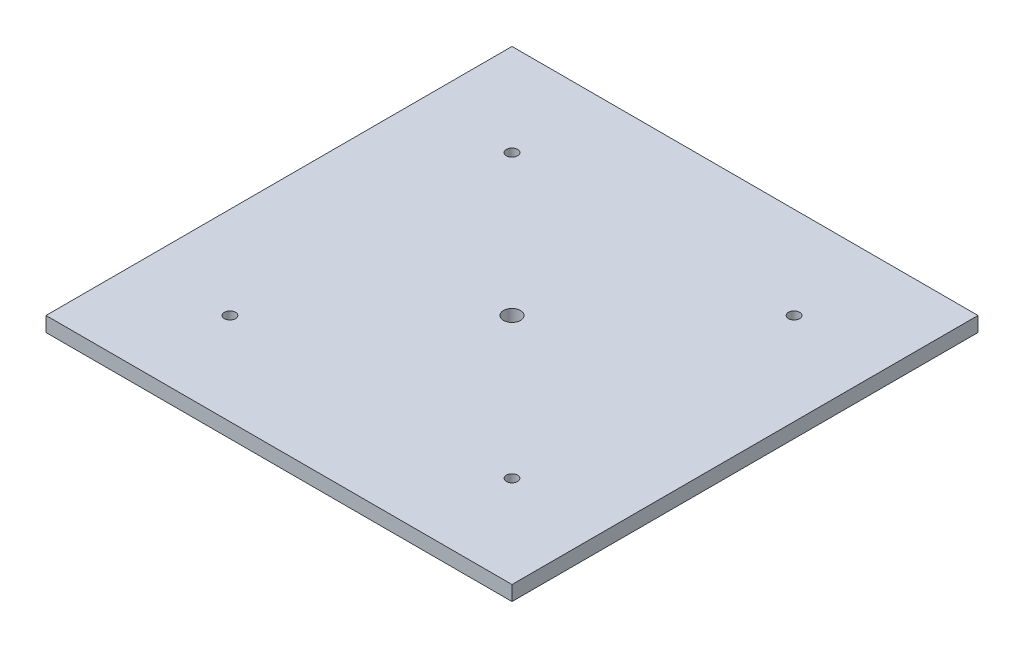
ISO-10303-21;
HEADER;
FILE_DESCRIPTION(('STEP AP214'),'2;1');
FILE_NAME('part.step','',(''),(''),'','','');
FILE_SCHEMA(('AUTOMOTIVE_DESIGN { 1 0 10303 214 1 1 1 1 }'));
ENDSEC;
DATA;
#1=APPLICATION_CONTEXT('core data for automotive mechanical design processes');
#2=APPLICATION_PROTOCOL_DEFINITION('international standard','automotive_design',2000,#1);
#3=PRODUCT_CONTEXT('',#1,'mechanical');
#4=PRODUCT('Part','Part','',(#3));
#5=PRODUCT_RELATED_PRODUCT_CATEGORY('part','',(#4));
#6=PRODUCT_DEFINITION_FORMATION('','',#4);
#7=PRODUCT_DEFINITION_CONTEXT('part definition',#1,'design');
#8=PRODUCT_DEFINITION('design','',#6,#7);
#9=PRODUCT_DEFINITION_SHAPE('','',#8);
#10=(LENGTH_UNIT() NAMED_UNIT(*) SI_UNIT(.MILLI.,.METRE.));
#11=(NAMED_UNIT(*) PLANE_ANGLE_UNIT() SI_UNIT($,.RADIAN.));
#12=(NAMED_UNIT(*) SI_UNIT($,.STERADIAN.) SOLID_ANGLE_UNIT());
#13=UNCERTAINTY_MEASURE_WITH_UNIT(LENGTH_MEASURE(1.E-05),#10,'distance_accuracy_value','');
#14=(GEOMETRIC_REPRESENTATION_CONTEXT(3) GLOBAL_UNCERTAINTY_ASSIGNED_CONTEXT((#13)) GLOBAL_UNIT_ASSIGNED_CONTEXT((#10,
#11,#12)) REPRESENTATION_CONTEXT('',''));
#15=CARTESIAN_POINT('',(0.,0.,0.));
#16=DIRECTION('',(0.,0.,1.));
#17=DIRECTION('',(1.,0.,0.));
#18=AXIS2_PLACEMENT_3D('',#15,#16,#17);
#19=CARTESIAN_POINT('',(0.,0.,0.));
#20=DIRECTION('',(0.,1.,0.));
#21=DIRECTION('',(0.,0.,1.));
#22=AXIS2_PLACEMENT_3D('',#19,#20,#21);
#23=PLANE('',#22);
#24=CARTESIAN_POINT('',(-60.53,0.,60.53));
#25=DIRECTION('',(0.,1.,0.));
#26=DIRECTION('',(0.,0.,1.));
#27=AXIS2_PLACEMENT_3D('',#24,#25,#26);
#28=CIRCLE('',#27,2.4);
#29=CARTESIAN_POINT('',(-60.53,0.,62.93));
#30=VERTEX_POINT('',#29);
#31=EDGE_CURVE('E132',#30,#30,#28,.F.);
#32=ORIENTED_EDGE('',*,*,#31,.F.);
#33=EDGE_LOOP('',(#32));
#34=FACE_BOUND('',#33,.T.);
#35=CARTESIAN_POINT('',(0.,0.,0.));
#36=DIRECTION('',(0.,1.,0.));
#37=DIRECTION('',(0.,0.,1.));
#38=AXIS2_PLACEMENT_3D('',#35,#36,#37);
#39=CIRCLE('',#38,3.675);
#40=CARTESIAN_POINT('',(0.,0.,3.675));
#41=VERTEX_POINT('',#40);
#42=EDGE_CURVE('E111',#41,#41,#39,.T.);
#43=ORIENTED_EDGE('',*,*,#42,.T.);
#44=EDGE_LOOP('',(#43));
#45=FACE_BOUND('',#44,.T.);
#46=DIRECTION('',(0.,0.,1.));
#47=VECTOR('',#46,1.);
#48=CARTESIAN_POINT('',(-100.,0.,-100.));
#49=LINE('',#48,#47);
#50=CARTESIAN_POINT('',(-100.,0.,-100.));
#51=VERTEX_POINT('',#50);
#52=CARTESIAN_POINT('',(-100.,0.,100.));
#53=VERTEX_POINT('',#52);
#54=EDGE_CURVE('E107',#51,#53,#49,.T.);
#55=ORIENTED_EDGE('',*,*,#54,.F.);
#56=DIRECTION('',(-1.,0.,0.));
#57=VECTOR('',#56,1.);
#58=CARTESIAN_POINT('',(-100.,0.,-100.));
#59=LINE('',#58,#57);
#60=CARTESIAN_POINT('',(100.,0.,-100.));
#61=VERTEX_POINT('',#60);
#62=EDGE_CURVE('E79',#61,#51,#59,.T.);
#63=ORIENTED_EDGE('',*,*,#62,.F.);
#64=DIRECTION('',(0.,0.,-1.));
#65=VECTOR('',#64,1.);
#66=CARTESIAN_POINT('',(100.,0.,-100.));
#67=LINE('',#66,#65);
#68=CARTESIAN_POINT('',(100.,0.,100.));
#69=VERTEX_POINT('',#68);
#70=EDGE_CURVE('E73',#69,#61,#67,.T.);
#71=ORIENTED_EDGE('',*,*,#70,.F.);
#72=DIRECTION('',(1.,0.,0.));
#73=VECTOR('',#72,1.);
#74=CARTESIAN_POINT('',(-100.,0.,100.));
#75=LINE('',#74,#73);
#76=EDGE_CURVE('E96',#53,#69,#75,.T.);
#77=ORIENTED_EDGE('',*,*,#76,.F.);
#78=EDGE_LOOP('',(#55,#63,#71,#77));
#79=FACE_BOUND('',#78,.T.);
#80=CARTESIAN_POINT('',(60.53,0.,60.53));
#81=DIRECTION('',(0.,1.,0.));
#82=DIRECTION('',(0.,0.,1.));
#83=AXIS2_PLACEMENT_3D('',#80,#81,#82);
#84=CIRCLE('',#83,2.39999999999999);
#85=CARTESIAN_POINT('',(60.53,0.,62.93));
#86=VERTEX_POINT('',#85);
#87=EDGE_CURVE('E140',#86,#86,#84,.F.);
#88=ORIENTED_EDGE('',*,*,#87,.F.);
#89=EDGE_LOOP('',(#88));
#90=FACE_BOUND('',#89,.T.);
#91=CARTESIAN_POINT('',(60.53,0.,-60.53));
#92=DIRECTION('',(0.,1.,0.));
#93=DIRECTION('',(0.,0.,1.));
#94=AXIS2_PLACEMENT_3D('',#91,#92,#93);
#95=CIRCLE('',#94,2.4);
#96=CARTESIAN_POINT('',(60.53,0.,-58.13));
#97=VERTEX_POINT('',#96);
#98=EDGE_CURVE('E148',#97,#97,#95,.F.);
#99=ORIENTED_EDGE('',*,*,#98,.F.);
#100=EDGE_LOOP('',(#99));
#101=FACE_BOUND('',#100,.T.);
#102=CARTESIAN_POINT('',(-60.53,0.,-60.53));
#103=DIRECTION('',(0.,1.,0.));
#104=DIRECTION('',(0.,0.,1.));
#105=AXIS2_PLACEMENT_3D('',#102,#103,#104);
#106=CIRCLE('',#105,2.4);
#107=CARTESIAN_POINT('',(-60.53,0.,-58.13));
#108=VERTEX_POINT('',#107);
#109=EDGE_CURVE('E156',#108,#108,#106,.F.);
#110=ORIENTED_EDGE('',*,*,#109,.F.);
#111=EDGE_LOOP('',(#110));
#112=FACE_BOUND('',#111,.T.);
#113=ADVANCED_FACE('F38',(#34,#45,#79,#90,#101,#112),#23,.F.);
#114=CARTESIAN_POINT('',(-100.,6.35,-100.));
#115=DIRECTION('',(1.,0.,0.));
#116=DIRECTION('',(0.,0.,-1.));
#117=AXIS2_PLACEMENT_3D('',#114,#115,#116);
#118=PLANE('',#117);
#119=ORIENTED_EDGE('',*,*,#54,.T.);
#120=DIRECTION('',(0.,-1.,0.));
#121=VECTOR('',#120,1.);
#122=CARTESIAN_POINT('',(-100.,6.35,100.));
#123=LINE('',#122,#121);
#124=CARTESIAN_POINT('',(-100.,6.35,100.));
#125=VERTEX_POINT('',#124);
#126=EDGE_CURVE('E11',#125,#53,#123,.T.);
#127=ORIENTED_EDGE('',*,*,#126,.F.);
#128=DIRECTION('',(0.,0.,1.));
#129=VECTOR('',#128,1.);
#130=CARTESIAN_POINT('',(-100.,6.35,-100.));
#131=LINE('',#130,#129);
#132=CARTESIAN_POINT('',(-100.,6.35,-100.));
#133=VERTEX_POINT('',#132);
#134=EDGE_CURVE('E91',#133,#125,#131,.T.);
#135=ORIENTED_EDGE('',*,*,#134,.F.);
#136=DIRECTION('',(0.,-1.,0.));
#137=VECTOR('',#136,1.);
#138=CARTESIAN_POINT('',(-100.,6.35,-100.));
#139=LINE('',#138,#137);
#140=EDGE_CURVE('E103',#133,#51,#139,.T.);
#141=ORIENTED_EDGE('',*,*,#140,.T.);
#142=EDGE_LOOP('',(#119,#127,#135,#141));
#143=FACE_BOUND('',#142,.T.);
#144=ADVANCED_FACE('F40',(#143),#118,.F.);
#145=CARTESIAN_POINT('',(-100.,6.35,100.));
#146=DIRECTION('',(0.,0.,-1.));
#147=DIRECTION('',(-1.,0.,0.));
#148=AXIS2_PLACEMENT_3D('',#145,#146,#147);
#149=PLANE('',#148);
#150=ORIENTED_EDGE('',*,*,#76,.T.);
#151=DIRECTION('',(0.,-1.,0.));
#152=VECTOR('',#151,1.);
#153=CARTESIAN_POINT('',(100.,6.35,100.));
#154=LINE('',#153,#152);
#155=CARTESIAN_POINT('',(100.,6.35,100.));
#156=VERTEX_POINT('',#155);
#157=EDGE_CURVE('E48',#156,#69,#154,.T.);
#158=ORIENTED_EDGE('',*,*,#157,.F.);
#159=DIRECTION('',(1.,0.,0.));
#160=VECTOR('',#159,1.);
#161=CARTESIAN_POINT('',(-100.,6.35,100.));
#162=LINE('',#161,#160);
#163=EDGE_CURVE('E86',#125,#156,#162,.T.);
#164=ORIENTED_EDGE('',*,*,#163,.F.);
#165=ORIENTED_EDGE('',*,*,#126,.T.);
#166=EDGE_LOOP('',(#150,#158,#164,#165));
#167=FACE_BOUND('',#166,.T.);
#168=ADVANCED_FACE('F95',(#167),#149,.F.);
#169=CARTESIAN_POINT('',(100.,6.35,-100.));
#170=DIRECTION('',(-1.,0.,0.));
#171=DIRECTION('',(0.,0.,1.));
#172=AXIS2_PLACEMENT_3D('',#169,#170,#171);
#173=PLANE('',#172);
#174=ORIENTED_EDGE('',*,*,#70,.T.);
#175=DIRECTION('',(0.,-1.,0.));
#176=VECTOR('',#175,1.);
#177=CARTESIAN_POINT('',(100.,6.35,-100.));
#178=LINE('',#177,#176);
#179=CARTESIAN_POINT('',(100.,6.35,-100.));
#180=VERTEX_POINT('',#179);
#181=EDGE_CURVE('E98',#180,#61,#178,.T.);
#182=ORIENTED_EDGE('',*,*,#181,.F.);
#183=DIRECTION('',(0.,0.,-1.));
#184=VECTOR('',#183,1.);
#185=CARTESIAN_POINT('',(100.,6.35,-100.));
#186=LINE('',#185,#184);
#187=EDGE_CURVE('E89',#156,#180,#186,.T.);
#188=ORIENTED_EDGE('',*,*,#187,.F.);
#189=ORIENTED_EDGE('',*,*,#157,.T.);
#190=EDGE_LOOP('',(#174,#182,#188,#189));
#191=FACE_BOUND('',#190,.T.);
#192=ADVANCED_FACE('F99',(#191),#173,.F.);
#193=CARTESIAN_POINT('',(-100.,6.35,-100.));
#194=DIRECTION('',(0.,0.,1.));
#195=DIRECTION('',(1.,0.,0.));
#196=AXIS2_PLACEMENT_3D('',#193,#194,#195);
#197=PLANE('',#196);
#198=ORIENTED_EDGE('',*,*,#62,.T.);
#199=ORIENTED_EDGE('',*,*,#140,.F.);
#200=DIRECTION('',(-1.,0.,0.));
#201=VECTOR('',#200,1.);
#202=CARTESIAN_POINT('',(-100.,6.35,-100.));
#203=LINE('',#202,#201);
#204=EDGE_CURVE('E56',#180,#133,#203,.T.);
#205=ORIENTED_EDGE('',*,*,#204,.F.);
#206=ORIENTED_EDGE('',*,*,#181,.T.);
#207=EDGE_LOOP('',(#198,#199,#205,#206));
#208=FACE_BOUND('',#207,.T.);
#209=ADVANCED_FACE('F121',(#208),#197,.F.);
#210=CARTESIAN_POINT('',(0.,6.35,0.));
#211=DIRECTION('',(0.,1.,0.));
#212=DIRECTION('',(0.,0.,1.));
#213=AXIS2_PLACEMENT_3D('',#210,#211,#212);
#214=PLANE('',#213);
#215=CARTESIAN_POINT('',(-60.53,6.35,-60.53));
#216=DIRECTION('',(0.,1.,0.));
#217=DIRECTION('',(0.,0.,1.));
#218=AXIS2_PLACEMENT_3D('',#215,#216,#217);
#219=CIRCLE('',#218,2.4);
#220=CARTESIAN_POINT('',(-60.53,6.35,-58.13));
#221=VERTEX_POINT('',#220);
#222=EDGE_CURVE('E160',#221,#221,#219,.T.);
#223=ORIENTED_EDGE('',*,*,#222,.F.);
#224=EDGE_LOOP('',(#223));
#225=FACE_BOUND('',#224,.T.);
#226=CARTESIAN_POINT('',(60.53,6.35,-60.53));
#227=DIRECTION('',(0.,1.,0.));
#228=DIRECTION('',(0.,0.,1.));
#229=AXIS2_PLACEMENT_3D('',#226,#227,#228);
#230=CIRCLE('',#229,2.4);
#231=CARTESIAN_POINT('',(60.53,6.35,-58.13));
#232=VERTEX_POINT('',#231);
#233=EDGE_CURVE('E152',#232,#232,#230,.T.);
#234=ORIENTED_EDGE('',*,*,#233,.F.);
#235=EDGE_LOOP('',(#234));
#236=FACE_BOUND('',#235,.T.);
#237=CARTESIAN_POINT('',(60.53,6.35,60.53));
#238=DIRECTION('',(0.,1.,0.));
#239=DIRECTION('',(0.,0.,1.));
#240=AXIS2_PLACEMENT_3D('',#237,#238,#239);
#241=CIRCLE('',#240,2.39999999999999);
#242=CARTESIAN_POINT('',(60.53,6.35,62.93));
#243=VERTEX_POINT('',#242);
#244=EDGE_CURVE('E144',#243,#243,#241,.T.);
#245=ORIENTED_EDGE('',*,*,#244,.F.);
#246=EDGE_LOOP('',(#245));
#247=FACE_BOUND('',#246,.T.);
#248=CARTESIAN_POINT('',(-60.53,6.35,60.53));
#249=DIRECTION('',(0.,1.,0.));
#250=DIRECTION('',(0.,0.,1.));
#251=AXIS2_PLACEMENT_3D('',#248,#249,#250);
#252=CIRCLE('',#251,2.4);
#253=CARTESIAN_POINT('',(-60.53,6.35,62.93));
#254=VERTEX_POINT('',#253);
#255=EDGE_CURVE('E136',#254,#254,#252,.T.);
#256=ORIENTED_EDGE('',*,*,#255,.F.);
#257=EDGE_LOOP('',(#256));
#258=FACE_BOUND('',#257,.T.);
#259=CARTESIAN_POINT('',(0.,6.35,0.));
#260=DIRECTION('',(0.,1.,0.));
#261=DIRECTION('',(0.,0.,1.));
#262=AXIS2_PLACEMENT_3D('',#259,#260,#261);
#263=CIRCLE('',#262,3.675);
#264=CARTESIAN_POINT('',(0.,6.35,3.675));
#265=VERTEX_POINT('',#264);
#266=EDGE_CURVE('E128',#265,#265,#263,.T.);
#267=ORIENTED_EDGE('',*,*,#266,.F.);
#268=EDGE_LOOP('',(#267));
#269=FACE_BOUND('',#268,.T.);
#270=ORIENTED_EDGE('',*,*,#134,.T.);
#271=ORIENTED_EDGE('',*,*,#163,.T.);
#272=ORIENTED_EDGE('',*,*,#187,.T.);
#273=ORIENTED_EDGE('',*,*,#204,.T.);
#274=EDGE_LOOP('',(#270,#271,#272,#273));
#275=FACE_BOUND('',#274,.T.);
#276=ADVANCED_FACE('F87',(#225,#236,#247,#258,#269,#275),#214,.T.);
#277=CARTESIAN_POINT('',(0.,0.,0.));
#278=DIRECTION('',(0.,1.,0.));
#279=DIRECTION('',(0.,0.,1.));
#280=AXIS2_PLACEMENT_3D('',#277,#278,#279);
#281=CYLINDRICAL_SURFACE('',#280,3.675);
#282=ORIENTED_EDGE('',*,*,#42,.F.);
#283=EDGE_LOOP('',(#282));
#284=FACE_BOUND('',#283,.T.);
#285=ORIENTED_EDGE('',*,*,#266,.T.);
#286=EDGE_LOOP('',(#285));
#287=FACE_BOUND('',#286,.T.);
#288=ADVANCED_FACE('F206',(#284,#287),#281,.F.);
#289=CARTESIAN_POINT('',(-60.53,6.35,60.53));
#290=DIRECTION('',(0.,1.,0.));
#291=DIRECTION('',(0.,0.,1.));
#292=AXIS2_PLACEMENT_3D('',#289,#290,#291);
#293=CYLINDRICAL_SURFACE('',#292,2.4);
#294=ORIENTED_EDGE('',*,*,#31,.T.);
#295=EDGE_LOOP('',(#294));
#296=FACE_BOUND('',#295,.T.);
#297=ORIENTED_EDGE('',*,*,#255,.T.);
#298=EDGE_LOOP('',(#297));
#299=FACE_BOUND('',#298,.T.);
#300=ADVANCED_FACE('F220',(#296,#299),#293,.F.);
#301=CARTESIAN_POINT('',(60.53,6.35,60.53));
#302=DIRECTION('',(0.,1.,0.));
#303=DIRECTION('',(0.,0.,1.));
#304=AXIS2_PLACEMENT_3D('',#301,#302,#303);
#305=CYLINDRICAL_SURFACE('',#304,2.39999999999999);
#306=ORIENTED_EDGE('',*,*,#87,.T.);
#307=EDGE_LOOP('',(#306));
#308=FACE_BOUND('',#307,.T.);
#309=ORIENTED_EDGE('',*,*,#244,.T.);
#310=EDGE_LOOP('',(#309));
#311=FACE_BOUND('',#310,.T.);
#312=ADVANCED_FACE('F225',(#308,#311),#305,.F.);
#313=CARTESIAN_POINT('',(60.53,6.35,-60.53));
#314=DIRECTION('',(0.,1.,0.));
#315=DIRECTION('',(0.,0.,1.));
#316=AXIS2_PLACEMENT_3D('',#313,#314,#315);
#317=CYLINDRICAL_SURFACE('',#316,2.4);
#318=ORIENTED_EDGE('',*,*,#98,.T.);
#319=EDGE_LOOP('',(#318));
#320=FACE_BOUND('',#319,.T.);
#321=ORIENTED_EDGE('',*,*,#233,.T.);
#322=EDGE_LOOP('',(#321));
#323=FACE_BOUND('',#322,.T.);
#324=ADVANCED_FACE('F232',(#320,#323),#317,.F.);
#325=CARTESIAN_POINT('',(-60.53,6.35,-60.53));
#326=DIRECTION('',(0.,1.,0.));
#327=DIRECTION('',(0.,0.,1.));
#328=AXIS2_PLACEMENT_3D('',#325,#326,#327);
#329=CYLINDRICAL_SURFACE('',#328,2.4);
#330=ORIENTED_EDGE('',*,*,#109,.T.);
#331=EDGE_LOOP('',(#330));
#332=FACE_BOUND('',#331,.T.);
#333=ORIENTED_EDGE('',*,*,#222,.T.);
#334=EDGE_LOOP('',(#333));
#335=FACE_BOUND('',#334,.T.);
#336=ADVANCED_FACE('F168',(#332,#335),#329,.F.);
#337=CLOSED_SHELL('',(#113,#144,#168,#192,#209,#276,#288,#300,#312,#324,#336));
#338=MANIFOLD_SOLID_BREP('B2',#337);
#339=ADVANCED_BREP_SHAPE_REPRESENTATION('',(#18,#338),#14);
#340=SHAPE_DEFINITION_REPRESENTATION(#9,#339);
ENDSEC;
END-ISO-10303-21;
